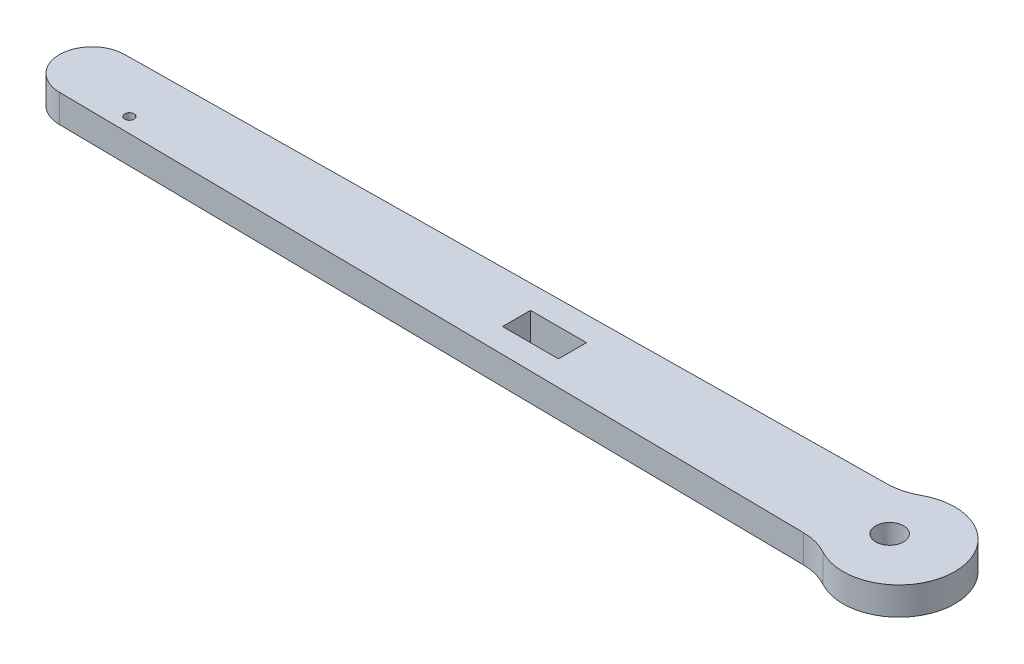
ISO-10303-21;
HEADER;
FILE_DESCRIPTION(('STEP AP214'),'2;1');
FILE_NAME('part.step','',(''),(''),'','','');
FILE_SCHEMA(('AUTOMOTIVE_DESIGN { 1 0 10303 214 1 1 1 1 }'));
ENDSEC;
DATA;
#1=APPLICATION_CONTEXT('core data for automotive mechanical design processes');
#2=APPLICATION_PROTOCOL_DEFINITION('international standard','automotive_design',2000,#1);
#3=PRODUCT_CONTEXT('',#1,'mechanical');
#4=PRODUCT('Part','Part','',(#3));
#5=PRODUCT_RELATED_PRODUCT_CATEGORY('part','',(#4));
#6=PRODUCT_DEFINITION_FORMATION('','',#4);
#7=PRODUCT_DEFINITION_CONTEXT('part definition',#1,'design');
#8=PRODUCT_DEFINITION('design','',#6,#7);
#9=PRODUCT_DEFINITION_SHAPE('','',#8);
#10=(LENGTH_UNIT() NAMED_UNIT(*) SI_UNIT(.MILLI.,.METRE.));
#11=(NAMED_UNIT(*) PLANE_ANGLE_UNIT() SI_UNIT($,.RADIAN.));
#12=(NAMED_UNIT(*) SI_UNIT($,.STERADIAN.) SOLID_ANGLE_UNIT());
#13=UNCERTAINTY_MEASURE_WITH_UNIT(LENGTH_MEASURE(1.E-05),#10,'distance_accuracy_value','');
#14=(GEOMETRIC_REPRESENTATION_CONTEXT(3) GLOBAL_UNCERTAINTY_ASSIGNED_CONTEXT((#13)) GLOBAL_UNIT_ASSIGNED_CONTEXT((#10,
#11,#12)) REPRESENTATION_CONTEXT('',''));
#15=CARTESIAN_POINT('',(0.,0.,0.));
#16=DIRECTION('',(0.,0.,1.));
#17=DIRECTION('',(1.,0.,0.));
#18=AXIS2_PLACEMENT_3D('',#15,#16,#17);
#19=CARTESIAN_POINT('',(41811.2646015621,-422.544949858023,1.5));
#20=DIRECTION('',(0.,1.,0.));
#21=DIRECTION('',(1.,0.,0.));
#22=AXIS2_PLACEMENT_3D('',#19,#20,#21);
#23=PLANE('',#22);
#24=DIRECTION('',(1.,0.,0.));
#25=VECTOR('',#24,1.);
#26=CARTESIAN_POINT('',(41856.7646015621,-422.544949858023,3.));
#27=LINE('',#26,#25);
#28=CARTESIAN_POINT('',(41856.7646015621,-422.544949858023,3.));
#29=VERTEX_POINT('',#28);
#30=CARTESIAN_POINT('',(41862.7646015621,-422.544949858023,3.));
#31=VERTEX_POINT('',#30);
#32=EDGE_CURVE('E124',#29,#31,#27,.T.);
#33=ORIENTED_EDGE('',*,*,#32,.F.);
#34=DIRECTION('',(0.,0.,1.));
#35=VECTOR('',#34,1.);
#36=CARTESIAN_POINT('',(41856.7646015621,-422.544949858023,0.));
#37=LINE('',#36,#35);
#38=CARTESIAN_POINT('',(41856.7646015621,-422.544949858023,0.));
#39=VERTEX_POINT('',#38);
#40=EDGE_CURVE('E116',#39,#29,#37,.T.);
#41=ORIENTED_EDGE('',*,*,#40,.F.);
#42=DIRECTION('',(-1.,0.,0.));
#43=VECTOR('',#42,1.);
#44=CARTESIAN_POINT('',(41856.7646015621,-422.544949858023,0.));
#45=LINE('',#44,#43);
#46=CARTESIAN_POINT('',(41862.7646015621,-422.544949858023,0.));
#47=VERTEX_POINT('',#46);
#48=EDGE_CURVE('E139',#47,#39,#45,.T.);
#49=ORIENTED_EDGE('',*,*,#48,.F.);
#50=DIRECTION('',(0.,0.,-1.));
#51=VECTOR('',#50,1.);
#52=CARTESIAN_POINT('',(41862.7646015621,-422.544949858023,0.));
#53=LINE('',#52,#51);
#54=EDGE_CURVE('E137',#31,#47,#53,.T.);
#55=ORIENTED_EDGE('',*,*,#54,.F.);
#56=EDGE_LOOP('',(#33,#41,#49,#55));
#57=FACE_BOUND('',#56,.T.);
#58=CARTESIAN_POINT('',(41896.7646015622,-422.544949858023,1.50000000007627));
#59=DIRECTION('',(0.,1.,0.));
#60=DIRECTION('',(1.,0.,0.));
#61=AXIS2_PLACEMENT_3D('',#58,#59,#60);
#62=CIRCLE('',#61,1.50000000000178);
#63=CARTESIAN_POINT('',(41898.2646015622,-422.544949858023,1.50000000007627));
#64=VERTEX_POINT('',#63);
#65=EDGE_CURVE('E155',#64,#64,#62,.T.);
#66=ORIENTED_EDGE('',*,*,#65,.F.);
#67=EDGE_LOOP('',(#66));
#68=FACE_BOUND('',#67,.T.);
#69=CARTESIAN_POINT('',(41811.2646015621,-422.544949858023,1.5));
#70=DIRECTION('',(0.,1.,0.));
#71=DIRECTION('',(1.,0.,0.));
#72=AXIS2_PLACEMENT_3D('',#69,#70,#71);
#73=CIRCLE('',#72,3.50000000002146);
#74=CARTESIAN_POINT('',(41811.2646015621,-422.544949858023,-2.00000000000061));
#75=VERTEX_POINT('',#74);
#76=CARTESIAN_POINT('',(41811.2646015554,-422.544949858023,5.0000000000423));
#77=VERTEX_POINT('',#76);
#78=EDGE_CURVE('E161',#75,#77,#73,.T.);
#79=ORIENTED_EDGE('',*,*,#78,.T.);
#80=DIRECTION('',(0.999922872655112,0.,0.0124196916688157));
#81=VECTOR('',#80,1.);
#82=CARTESIAN_POINT('',(41811.2646015554,-422.544949858023,5.0000000000423));
#83=LINE('',#82,#81);
#84=CARTESIAN_POINT('',(41892.0315278088,-422.544949858023,6.00317769357117));
#85=VERTEX_POINT('',#84);
#86=EDGE_CURVE('E164',#77,#85,#83,.T.);
#87=ORIENTED_EDGE('',*,*,#86,.T.);
#88=CARTESIAN_POINT('',(41891.9601042987,-422.544949858023,12.0027525685727));
#89=DIRECTION('',(0.,-1.,0.));
#90=DIRECTION('',(1.,0.,0.));
#91=AXIS2_PLACEMENT_3D('',#88,#89,#90);
#92=CIRCLE('',#91,5.9999999998787);
#93=CARTESIAN_POINT('',(41894.8623529304,-422.544949858023,6.75137628433936));
#94=VERTEX_POINT('',#93);
#95=EDGE_CURVE('E167',#85,#94,#92,.T.);
#96=ORIENTED_EDGE('',*,*,#95,.T.);
#97=CARTESIAN_POINT('',(41897.7646015621,-422.544949858023,1.5));
#98=DIRECTION('',(0.,1.,0.));
#99=DIRECTION('',(1.,0.,0.));
#100=AXIS2_PLACEMENT_3D('',#97,#98,#99);
#101=CIRCLE('',#100,6.00000000000711);
#102=CARTESIAN_POINT('',(41894.8623529304,-422.544949858023,-3.7513762842829));
#103=VERTEX_POINT('',#102);
#104=EDGE_CURVE('E169',#94,#103,#101,.T.);
#105=ORIENTED_EDGE('',*,*,#104,.T.);
#106=CARTESIAN_POINT('',(41891.9601042987,-422.544949858023,-9.0027525685728));
#107=DIRECTION('',(0.,-1.,0.));
#108=DIRECTION('',(1.,0.,0.));
#109=AXIS2_PLACEMENT_3D('',#106,#107,#108);
#110=CIRCLE('',#109,5.99999999995032);
#111=CARTESIAN_POINT('',(41892.0315278088,-422.544949858023,-3.00317769343617));
#112=VERTEX_POINT('',#111);
#113=EDGE_CURVE('E171',#103,#112,#110,.T.);
#114=ORIENTED_EDGE('',*,*,#113,.T.);
#115=DIRECTION('',(-0.999922872655115,0.,0.0124196916685931));
#116=VECTOR('',#115,1.);
#117=CARTESIAN_POINT('',(41811.2646015621,-422.544949858023,-2.00000000000061));
#118=LINE('',#117,#116);
#119=EDGE_CURVE('E173',#112,#75,#118,.T.);
#120=ORIENTED_EDGE('',*,*,#119,.T.);
#121=EDGE_LOOP('',(#79,#87,#96,#105,#114,#120));
#122=FACE_BOUND('',#121,.T.);
#123=CARTESIAN_POINT('',(41817.2646015621,-422.544949858023,3.49999999906864));
#124=DIRECTION('',(0.,1.,0.));
#125=DIRECTION('',(1.,0.,0.));
#126=AXIS2_PLACEMENT_3D('',#123,#124,#125);
#127=CIRCLE('',#126,0.499999999998327);
#128=CARTESIAN_POINT('',(41817.7646015621,-422.544949858023,3.49999999906864));
#129=VERTEX_POINT('',#128);
#130=EDGE_CURVE('E145',#129,#129,#127,.T.);
#131=ORIENTED_EDGE('',*,*,#130,.F.);
#132=EDGE_LOOP('',(#131));
#133=FACE_BOUND('',#132,.T.);
#134=ADVANCED_FACE('F39',(#57,#68,#122,#133),#23,.T.);
#135=CARTESIAN_POINT('',(41811.2646015621,-425.544949858023,1.5));
#136=DIRECTION('',(0.,1.,0.));
#137=DIRECTION('',(1.,0.,0.));
#138=AXIS2_PLACEMENT_3D('',#135,#136,#137);
#139=PLANE('',#138);
#140=CARTESIAN_POINT('',(41896.7646015622,-425.544949858023,1.50000000007627));
#141=DIRECTION('',(0.,1.,0.));
#142=DIRECTION('',(1.,0.,0.));
#143=AXIS2_PLACEMENT_3D('',#140,#141,#142);
#144=CIRCLE('',#143,1.50000000000178);
#145=CARTESIAN_POINT('',(41898.2646015622,-425.544949858023,1.50000000007627));
#146=VERTEX_POINT('',#145);
#147=EDGE_CURVE('E132',#146,#146,#144,.T.);
#148=ORIENTED_EDGE('',*,*,#147,.T.);
#149=EDGE_LOOP('',(#148));
#150=FACE_BOUND('',#149,.T.);
#151=CARTESIAN_POINT('',(41811.2646015621,-425.544949858023,1.5));
#152=DIRECTION('',(0.,1.,0.));
#153=DIRECTION('',(1.,0.,0.));
#154=AXIS2_PLACEMENT_3D('',#151,#152,#153);
#155=CIRCLE('',#154,3.50000000002146);
#156=CARTESIAN_POINT('',(41811.2646015621,-425.544949858023,-2.00000000000061));
#157=VERTEX_POINT('',#156);
#158=CARTESIAN_POINT('',(41811.2646015554,-425.544949858023,5.0000000000423));
#159=VERTEX_POINT('',#158);
#160=EDGE_CURVE('E158',#157,#159,#155,.T.);
#161=ORIENTED_EDGE('',*,*,#160,.F.);
#162=DIRECTION('',(-0.999922872655115,0.,0.0124196916685931));
#163=VECTOR('',#162,1.);
#164=CARTESIAN_POINT('',(41811.2646015621,-425.544949858023,-2.00000000000061));
#165=LINE('',#164,#163);
#166=CARTESIAN_POINT('',(41892.0315278088,-425.544949858023,-3.00317769343617));
#167=VERTEX_POINT('',#166);
#168=EDGE_CURVE('E165',#167,#157,#165,.T.);
#169=ORIENTED_EDGE('',*,*,#168,.F.);
#170=CARTESIAN_POINT('',(41891.9601042987,-425.544949858023,-9.0027525685728));
#171=DIRECTION('',(0.,-1.,0.));
#172=DIRECTION('',(1.,0.,0.));
#173=AXIS2_PLACEMENT_3D('',#170,#171,#172);
#174=CIRCLE('',#173,5.99999999995032);
#175=CARTESIAN_POINT('',(41894.8623529304,-425.544949858023,-3.7513762842829));
#176=VERTEX_POINT('',#175);
#177=EDGE_CURVE('E184',#176,#167,#174,.T.);
#178=ORIENTED_EDGE('',*,*,#177,.F.);
#179=CARTESIAN_POINT('',(41897.7646015621,-425.544949858023,1.5));
#180=DIRECTION('',(0.,1.,0.));
#181=DIRECTION('',(1.,0.,0.));
#182=AXIS2_PLACEMENT_3D('',#179,#180,#181);
#183=CIRCLE('',#182,6.00000000000711);
#184=CARTESIAN_POINT('',(41894.8623529304,-425.544949858023,6.75137628433936));
#185=VERTEX_POINT('',#184);
#186=EDGE_CURVE('E182',#185,#176,#183,.T.);
#187=ORIENTED_EDGE('',*,*,#186,.F.);
#188=CARTESIAN_POINT('',(41891.9601042987,-425.544949858023,12.0027525685727));
#189=DIRECTION('',(0.,-1.,0.));
#190=DIRECTION('',(1.,0.,0.));
#191=AXIS2_PLACEMENT_3D('',#188,#189,#190);
#192=CIRCLE('',#191,5.9999999998787);
#193=CARTESIAN_POINT('',(41892.0315278088,-425.544949858023,6.00317769357117));
#194=VERTEX_POINT('',#193);
#195=EDGE_CURVE('E180',#194,#185,#192,.T.);
#196=ORIENTED_EDGE('',*,*,#195,.F.);
#197=DIRECTION('',(0.999922872655112,0.,0.0124196916688157));
#198=VECTOR('',#197,1.);
#199=CARTESIAN_POINT('',(41811.2646015554,-425.544949858023,5.0000000000423));
#200=LINE('',#199,#198);
#201=EDGE_CURVE('E178',#159,#194,#200,.T.);
#202=ORIENTED_EDGE('',*,*,#201,.F.);
#203=EDGE_LOOP('',(#161,#169,#178,#187,#196,#202));
#204=FACE_BOUND('',#203,.T.);
#205=DIRECTION('',(0.,0.,1.));
#206=VECTOR('',#205,1.);
#207=CARTESIAN_POINT('',(41856.7646015621,-425.544949858023,0.));
#208=LINE('',#207,#206);
#209=CARTESIAN_POINT('',(41856.7646015621,-425.544949858023,0.));
#210=VERTEX_POINT('',#209);
#211=CARTESIAN_POINT('',(41856.7646015621,-425.544949858023,3.));
#212=VERTEX_POINT('',#211);
#213=EDGE_CURVE('E62',#210,#212,#208,.T.);
#214=ORIENTED_EDGE('',*,*,#213,.T.);
#215=DIRECTION('',(1.,0.,0.));
#216=VECTOR('',#215,1.);
#217=CARTESIAN_POINT('',(41856.7646015621,-425.544949858023,3.));
#218=LINE('',#217,#216);
#219=CARTESIAN_POINT('',(41862.7646015621,-425.544949858023,3.));
#220=VERTEX_POINT('',#219);
#221=EDGE_CURVE('E131',#212,#220,#218,.T.);
#222=ORIENTED_EDGE('',*,*,#221,.T.);
#223=DIRECTION('',(0.,0.,-1.));
#224=VECTOR('',#223,1.);
#225=CARTESIAN_POINT('',(41862.7646015621,-425.544949858023,0.));
#226=LINE('',#225,#224);
#227=CARTESIAN_POINT('',(41862.7646015621,-425.544949858023,0.));
#228=VERTEX_POINT('',#227);
#229=EDGE_CURVE('E147',#220,#228,#226,.T.);
#230=ORIENTED_EDGE('',*,*,#229,.T.);
#231=DIRECTION('',(-1.,0.,0.));
#232=VECTOR('',#231,1.);
#233=CARTESIAN_POINT('',(41856.7646015621,-425.544949858023,0.));
#234=LINE('',#233,#232);
#235=EDGE_CURVE('E125',#228,#210,#234,.T.);
#236=ORIENTED_EDGE('',*,*,#235,.T.);
#237=EDGE_LOOP('',(#214,#222,#230,#236));
#238=FACE_BOUND('',#237,.T.);
#239=CARTESIAN_POINT('',(41817.2646015621,-425.544949858023,3.49999999906864));
#240=DIRECTION('',(0.,1.,0.));
#241=DIRECTION('',(1.,0.,0.));
#242=AXIS2_PLACEMENT_3D('',#239,#240,#241);
#243=CIRCLE('',#242,0.499999999998327);
#244=CARTESIAN_POINT('',(41817.7646015621,-425.544949858023,3.49999999906864));
#245=VERTEX_POINT('',#244);
#246=EDGE_CURVE('E269',#245,#245,#243,.T.);
#247=ORIENTED_EDGE('',*,*,#246,.T.);
#248=EDGE_LOOP('',(#247));
#249=FACE_BOUND('',#248,.T.);
#250=ADVANCED_FACE('F208',(#150,#204,#238,#249),#139,.F.);
#251=CARTESIAN_POINT('',(41811.2646015621,-422.544949858023,1.5));
#252=DIRECTION('',(0.,-1.,0.));
#253=DIRECTION('',(-1.,0.,0.));
#254=AXIS2_PLACEMENT_3D('',#251,#252,#253);
#255=CYLINDRICAL_SURFACE('',#254,3.50000000002146);
#256=ORIENTED_EDGE('',*,*,#160,.T.);
#257=DIRECTION('',(0.,-1.,0.));
#258=VECTOR('',#257,1.);
#259=CARTESIAN_POINT('',(41811.2646015554,-422.544949858023,5.0000000000423));
#260=LINE('',#259,#258);
#261=EDGE_CURVE('E11',#77,#159,#260,.T.);
#262=ORIENTED_EDGE('',*,*,#261,.F.);
#263=ORIENTED_EDGE('',*,*,#78,.F.);
#264=DIRECTION('',(0.,-1.,0.));
#265=VECTOR('',#264,1.);
#266=CARTESIAN_POINT('',(41811.2646015621,-422.544949858023,-2.00000000000061));
#267=LINE('',#266,#265);
#268=EDGE_CURVE('E175',#75,#157,#267,.T.);
#269=ORIENTED_EDGE('',*,*,#268,.T.);
#270=EDGE_LOOP('',(#256,#262,#263,#269));
#271=FACE_BOUND('',#270,.T.);
#272=ADVANCED_FACE('F41',(#271),#255,.T.);
#273=CARTESIAN_POINT('',(41811.2646015554,-422.544949858023,5.0000000000423));
#274=DIRECTION('',(0.0124196916688157,0.,-0.999922872655112));
#275=DIRECTION('',(-0.999922872655112,0.,-0.0124196916688158));
#276=AXIS2_PLACEMENT_3D('',#273,#274,#275);
#277=PLANE('',#276);
#278=ORIENTED_EDGE('',*,*,#201,.T.);
#279=DIRECTION('',(0.,-1.,0.));
#280=VECTOR('',#279,1.);
#281=CARTESIAN_POINT('',(41892.0315278088,-422.544949858023,6.00317769357117));
#282=LINE('',#281,#280);
#283=EDGE_CURVE('E47',#85,#194,#282,.T.);
#284=ORIENTED_EDGE('',*,*,#283,.F.);
#285=ORIENTED_EDGE('',*,*,#86,.F.);
#286=ORIENTED_EDGE('',*,*,#261,.T.);
#287=EDGE_LOOP('',(#278,#284,#285,#286));
#288=FACE_BOUND('',#287,.T.);
#289=ADVANCED_FACE('F226',(#288),#277,.F.);
#290=CARTESIAN_POINT('',(41891.9601042987,-422.544949858023,12.0027525685727));
#291=DIRECTION('',(0.,-1.,0.));
#292=DIRECTION('',(-1.,0.,0.));
#293=AXIS2_PLACEMENT_3D('',#290,#291,#292);
#294=CYLINDRICAL_SURFACE('',#293,5.9999999998787);
#295=ORIENTED_EDGE('',*,*,#195,.T.);
#296=DIRECTION('',(0.,-1.,0.));
#297=VECTOR('',#296,1.);
#298=CARTESIAN_POINT('',(41894.8623529304,-422.544949858023,6.75137628433936));
#299=LINE('',#298,#297);
#300=EDGE_CURVE('E195',#94,#185,#299,.T.);
#301=ORIENTED_EDGE('',*,*,#300,.F.);
#302=ORIENTED_EDGE('',*,*,#95,.F.);
#303=ORIENTED_EDGE('',*,*,#283,.T.);
#304=EDGE_LOOP('',(#295,#301,#302,#303));
#305=FACE_BOUND('',#304,.T.);
#306=ADVANCED_FACE('F202',(#305),#294,.F.);
#307=CARTESIAN_POINT('',(41897.7646015621,-422.544949858023,1.5));
#308=DIRECTION('',(0.,-1.,0.));
#309=DIRECTION('',(-1.,0.,0.));
#310=AXIS2_PLACEMENT_3D('',#307,#308,#309);
#311=CYLINDRICAL_SURFACE('',#310,6.00000000000711);
#312=ORIENTED_EDGE('',*,*,#186,.T.);
#313=DIRECTION('',(0.,-1.,0.));
#314=VECTOR('',#313,1.);
#315=CARTESIAN_POINT('',(41894.8623529304,-422.544949858023,-3.7513762842829));
#316=LINE('',#315,#314);
#317=EDGE_CURVE('E192',#103,#176,#316,.T.);
#318=ORIENTED_EDGE('',*,*,#317,.F.);
#319=ORIENTED_EDGE('',*,*,#104,.F.);
#320=ORIENTED_EDGE('',*,*,#300,.T.);
#321=EDGE_LOOP('',(#312,#318,#319,#320));
#322=FACE_BOUND('',#321,.T.);
#323=ADVANCED_FACE('F214',(#322),#311,.T.);
#324=CARTESIAN_POINT('',(41891.9601042987,-422.544949858023,-9.0027525685728));
#325=DIRECTION('',(0.,-1.,0.));
#326=DIRECTION('',(-1.,0.,0.));
#327=AXIS2_PLACEMENT_3D('',#324,#325,#326);
#328=CYLINDRICAL_SURFACE('',#327,5.99999999995032);
#329=ORIENTED_EDGE('',*,*,#177,.T.);
#330=DIRECTION('',(0.,-1.,0.));
#331=VECTOR('',#330,1.);
#332=CARTESIAN_POINT('',(41892.0315278088,-422.544949858023,-3.00317769343617));
#333=LINE('',#332,#331);
#334=EDGE_CURVE('E189',#112,#167,#333,.T.);
#335=ORIENTED_EDGE('',*,*,#334,.F.);
#336=ORIENTED_EDGE('',*,*,#113,.F.);
#337=ORIENTED_EDGE('',*,*,#317,.T.);
#338=EDGE_LOOP('',(#329,#335,#336,#337));
#339=FACE_BOUND('',#338,.T.);
#340=ADVANCED_FACE('F218',(#339),#328,.F.);
#341=CARTESIAN_POINT('',(41811.2646015621,-422.544949858023,-2.00000000000061));
#342=DIRECTION('',(0.0124196916685931,0.,0.999922872655115));
#343=DIRECTION('',(0.999922872655115,0.,-0.0124196916685931));
#344=AXIS2_PLACEMENT_3D('',#341,#342,#343);
#345=PLANE('',#344);
#346=ORIENTED_EDGE('',*,*,#168,.T.);
#347=ORIENTED_EDGE('',*,*,#268,.F.);
#348=ORIENTED_EDGE('',*,*,#119,.F.);
#349=ORIENTED_EDGE('',*,*,#334,.T.);
#350=EDGE_LOOP('',(#346,#347,#348,#349));
#351=FACE_BOUND('',#350,.T.);
#352=ADVANCED_FACE('F229',(#351),#345,.F.);
#353=CARTESIAN_POINT('',(41896.7646015622,-422.544949858023,1.50000000007627));
#354=DIRECTION('',(0.,-1.,0.));
#355=DIRECTION('',(-1.,0.,0.));
#356=AXIS2_PLACEMENT_3D('',#353,#354,#355);
#357=CYLINDRICAL_SURFACE('',#356,1.50000000000178);
#358=ORIENTED_EDGE('',*,*,#65,.T.);
#359=EDGE_LOOP('',(#358));
#360=FACE_BOUND('',#359,.T.);
#361=ORIENTED_EDGE('',*,*,#147,.F.);
#362=EDGE_LOOP('',(#361));
#363=FACE_BOUND('',#362,.T.);
#364=ADVANCED_FACE('F231',(#360,#363),#357,.F.);
#365=CARTESIAN_POINT('',(41856.7646015621,-422.544949858023,0.));
#366=DIRECTION('',(1.,0.,0.));
#367=DIRECTION('',(0.,-1.,0.));
#368=AXIS2_PLACEMENT_3D('',#365,#366,#367);
#369=PLANE('',#368);
#370=ORIENTED_EDGE('',*,*,#213,.F.);
#371=DIRECTION('',(0.,-1.,0.));
#372=VECTOR('',#371,1.);
#373=CARTESIAN_POINT('',(41856.7646015621,-422.544949858023,0.));
#374=LINE('',#373,#372);
#375=EDGE_CURVE('E120',#39,#210,#374,.T.);
#376=ORIENTED_EDGE('',*,*,#375,.F.);
#377=ORIENTED_EDGE('',*,*,#40,.T.);
#378=DIRECTION('',(0.,-1.,0.));
#379=VECTOR('',#378,1.);
#380=CARTESIAN_POINT('',(41856.7646015621,-422.544949858023,3.));
#381=LINE('',#380,#379);
#382=EDGE_CURVE('E119',#29,#212,#381,.T.);
#383=ORIENTED_EDGE('',*,*,#382,.T.);
#384=EDGE_LOOP('',(#370,#376,#377,#383));
#385=FACE_BOUND('',#384,.T.);
#386=ADVANCED_FACE('F118',(#385),#369,.T.);
#387=CARTESIAN_POINT('',(41856.7646015621,-422.544949858023,3.));
#388=DIRECTION('',(0.,0.,-1.));
#389=DIRECTION('',(0.,1.,0.));
#390=AXIS2_PLACEMENT_3D('',#387,#388,#389);
#391=PLANE('',#390);
#392=ORIENTED_EDGE('',*,*,#221,.F.);
#393=ORIENTED_EDGE('',*,*,#382,.F.);
#394=ORIENTED_EDGE('',*,*,#32,.T.);
#395=DIRECTION('',(0.,-1.,0.));
#396=VECTOR('',#395,1.);
#397=CARTESIAN_POINT('',(41862.7646015621,-422.544949858023,3.));
#398=LINE('',#397,#396);
#399=EDGE_CURVE('E133',#31,#220,#398,.T.);
#400=ORIENTED_EDGE('',*,*,#399,.T.);
#401=EDGE_LOOP('',(#392,#393,#394,#400));
#402=FACE_BOUND('',#401,.T.);
#403=ADVANCED_FACE('F128',(#402),#391,.T.);
#404=CARTESIAN_POINT('',(41862.7646015621,-422.544949858023,0.));
#405=DIRECTION('',(-1.,0.,0.));
#406=DIRECTION('',(0.,1.,0.));
#407=AXIS2_PLACEMENT_3D('',#404,#405,#406);
#408=PLANE('',#407);
#409=ORIENTED_EDGE('',*,*,#229,.F.);
#410=ORIENTED_EDGE('',*,*,#399,.F.);
#411=ORIENTED_EDGE('',*,*,#54,.T.);
#412=DIRECTION('',(0.,-1.,0.));
#413=VECTOR('',#412,1.);
#414=CARTESIAN_POINT('',(41862.7646015621,-422.544949858023,0.));
#415=LINE('',#414,#413);
#416=EDGE_CURVE('E54',#47,#228,#415,.T.);
#417=ORIENTED_EDGE('',*,*,#416,.T.);
#418=EDGE_LOOP('',(#409,#410,#411,#417));
#419=FACE_BOUND('',#418,.T.);
#420=ADVANCED_FACE('F252',(#419),#408,.T.);
#421=CARTESIAN_POINT('',(41856.7646015621,-422.544949858023,0.));
#422=DIRECTION('',(0.,0.,1.));
#423=DIRECTION('',(0.,-1.,0.));
#424=AXIS2_PLACEMENT_3D('',#421,#422,#423);
#425=PLANE('',#424);
#426=ORIENTED_EDGE('',*,*,#235,.F.);
#427=ORIENTED_EDGE('',*,*,#416,.F.);
#428=ORIENTED_EDGE('',*,*,#48,.T.);
#429=ORIENTED_EDGE('',*,*,#375,.T.);
#430=EDGE_LOOP('',(#426,#427,#428,#429));
#431=FACE_BOUND('',#430,.T.);
#432=ADVANCED_FACE('F255',(#431),#425,.T.);
#433=CARTESIAN_POINT('',(41817.2646015621,-422.544949858023,3.49999999906864));
#434=DIRECTION('',(0.,-1.,0.));
#435=DIRECTION('',(-1.,0.,0.));
#436=AXIS2_PLACEMENT_3D('',#433,#434,#435);
#437=CYLINDRICAL_SURFACE('',#436,0.499999999998327);
#438=ORIENTED_EDGE('',*,*,#130,.T.);
#439=EDGE_LOOP('',(#438));
#440=FACE_BOUND('',#439,.T.);
#441=ORIENTED_EDGE('',*,*,#246,.F.);
#442=EDGE_LOOP('',(#441));
#443=FACE_BOUND('',#442,.T.);
#444=ADVANCED_FACE('F259',(#440,#443),#437,.F.);
#445=CLOSED_SHELL('',(#134,#250,#272,#289,#306,#323,#340,#352,#364,#386,#403,#420,#432,#444));
#446=MANIFOLD_SOLID_BREP('B2',#445);
#447=ADVANCED_BREP_SHAPE_REPRESENTATION('',(#18,#446),#14);
#448=SHAPE_DEFINITION_REPRESENTATION(#9,#447);
ENDSEC;
END-ISO-10303-21;
